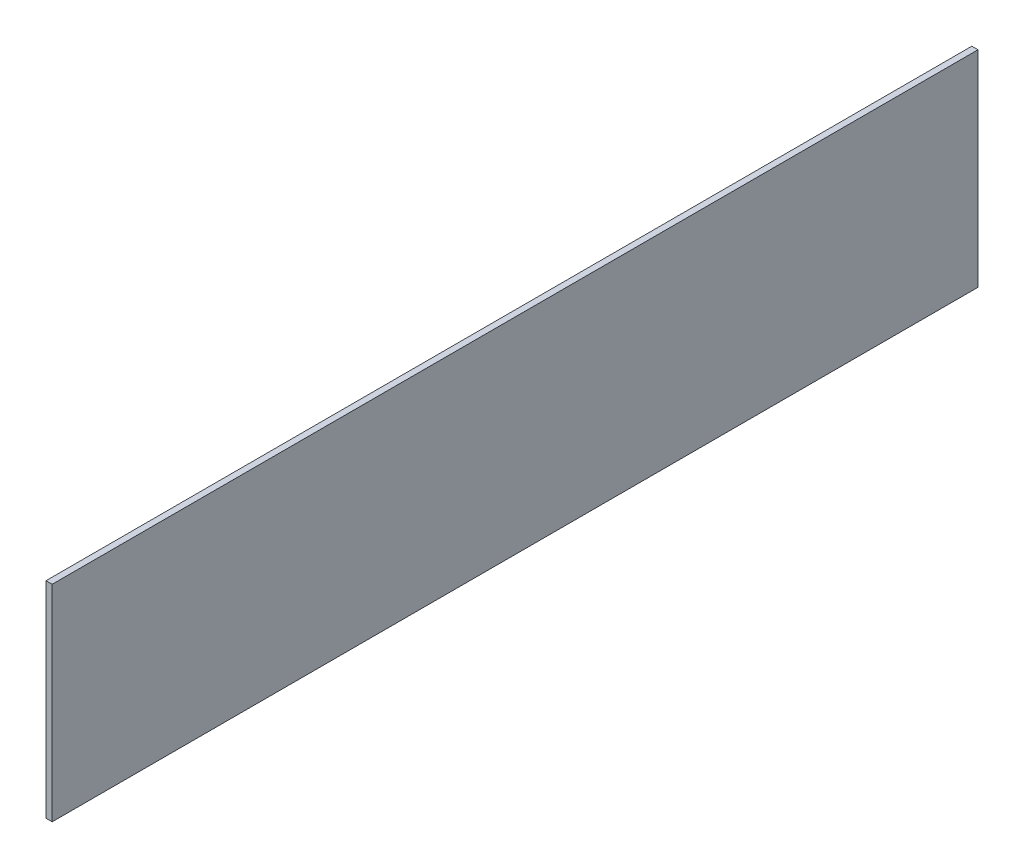
ISO-10303-21;
HEADER;
FILE_DESCRIPTION(('STEP AP214'),'2;1');
FILE_NAME('part.step','',(''),(''),'','','');
FILE_SCHEMA(('AUTOMOTIVE_DESIGN { 1 0 10303 214 1 1 1 1 }'));
ENDSEC;
DATA;
#1=APPLICATION_CONTEXT('core data for automotive mechanical design processes');
#2=APPLICATION_PROTOCOL_DEFINITION('international standard','automotive_design',2000,#1);
#3=PRODUCT_CONTEXT('',#1,'mechanical');
#4=PRODUCT('Part','Part','',(#3));
#5=PRODUCT_RELATED_PRODUCT_CATEGORY('part','',(#4));
#6=PRODUCT_DEFINITION_FORMATION('','',#4);
#7=PRODUCT_DEFINITION_CONTEXT('part definition',#1,'design');
#8=PRODUCT_DEFINITION('design','',#6,#7);
#9=PRODUCT_DEFINITION_SHAPE('','',#8);
#10=(LENGTH_UNIT() NAMED_UNIT(*) SI_UNIT(.MILLI.,.METRE.));
#11=(NAMED_UNIT(*) PLANE_ANGLE_UNIT() SI_UNIT($,.RADIAN.));
#12=(NAMED_UNIT(*) SI_UNIT($,.STERADIAN.) SOLID_ANGLE_UNIT());
#13=UNCERTAINTY_MEASURE_WITH_UNIT(LENGTH_MEASURE(1.E-05),#10,'distance_accuracy_value','');
#14=(GEOMETRIC_REPRESENTATION_CONTEXT(3) GLOBAL_UNCERTAINTY_ASSIGNED_CONTEXT((#13)) GLOBAL_UNIT_ASSIGNED_CONTEXT((#10,
#11,#12)) REPRESENTATION_CONTEXT('',''));
#15=CARTESIAN_POINT('',(0.,0.,0.));
#16=DIRECTION('',(0.,0.,1.));
#17=DIRECTION('',(1.,0.,0.));
#18=AXIS2_PLACEMENT_3D('',#15,#16,#17);
#19=CARTESIAN_POINT('',(3.,50.,-225.));
#20=DIRECTION('',(0.,0.,1.));
#21=DIRECTION('',(0.,-1.,0.));
#22=AXIS2_PLACEMENT_3D('',#19,#20,#21);
#23=PLANE('',#22);
#24=DIRECTION('',(0.,1.,0.));
#25=VECTOR('',#24,1.);
#26=CARTESIAN_POINT('',(0.,50.,-225.));
#27=LINE('',#26,#25);
#28=CARTESIAN_POINT('',(0.,-50.,-225.));
#29=VERTEX_POINT('',#28);
#30=CARTESIAN_POINT('',(0.,50.,-225.));
#31=VERTEX_POINT('',#30);
#32=EDGE_CURVE('E99',#29,#31,#27,.T.);
#33=ORIENTED_EDGE('',*,*,#32,.T.);
#34=DIRECTION('',(-1.,0.,0.));
#35=VECTOR('',#34,1.);
#36=CARTESIAN_POINT('',(3.,50.,-225.));
#37=LINE('',#36,#35);
#38=CARTESIAN_POINT('',(3.,50.,-225.));
#39=VERTEX_POINT('',#38);
#40=EDGE_CURVE('E11',#39,#31,#37,.T.);
#41=ORIENTED_EDGE('',*,*,#40,.F.);
#42=DIRECTION('',(0.,1.,0.));
#43=VECTOR('',#42,1.);
#44=CARTESIAN_POINT('',(3.,50.,-225.));
#45=LINE('',#44,#43);
#46=CARTESIAN_POINT('',(3.,-50.,-225.));
#47=VERTEX_POINT('',#46);
#48=EDGE_CURVE('E87',#47,#39,#45,.T.);
#49=ORIENTED_EDGE('',*,*,#48,.F.);
#50=DIRECTION('',(-1.,0.,0.));
#51=VECTOR('',#50,1.);
#52=CARTESIAN_POINT('',(3.,-50.,-225.));
#53=LINE('',#52,#51);
#54=EDGE_CURVE('E95',#47,#29,#53,.T.);
#55=ORIENTED_EDGE('',*,*,#54,.T.);
#56=EDGE_LOOP('',(#33,#41,#49,#55));
#57=FACE_BOUND('',#56,.T.);
#58=ADVANCED_FACE('F36',(#57),#23,.F.);
#59=CARTESIAN_POINT('',(3.,50.,225.));
#60=DIRECTION('',(0.,-1.,0.));
#61=DIRECTION('',(0.,0.,-1.));
#62=AXIS2_PLACEMENT_3D('',#59,#60,#61);
#63=PLANE('',#62);
#64=DIRECTION('',(0.,0.,1.));
#65=VECTOR('',#64,1.);
#66=CARTESIAN_POINT('',(0.,50.,225.));
#67=LINE('',#66,#65);
#68=CARTESIAN_POINT('',(0.,50.,225.));
#69=VERTEX_POINT('',#68);
#70=EDGE_CURVE('E91',#31,#69,#67,.T.);
#71=ORIENTED_EDGE('',*,*,#70,.T.);
#72=DIRECTION('',(-1.,0.,0.));
#73=VECTOR('',#72,1.);
#74=CARTESIAN_POINT('',(3.,50.,225.));
#75=LINE('',#74,#73);
#76=CARTESIAN_POINT('',(3.,50.,225.));
#77=VERTEX_POINT('',#76);
#78=EDGE_CURVE('E44',#77,#69,#75,.T.);
#79=ORIENTED_EDGE('',*,*,#78,.F.);
#80=DIRECTION('',(0.,0.,1.));
#81=VECTOR('',#80,1.);
#82=CARTESIAN_POINT('',(3.,50.,225.));
#83=LINE('',#82,#81);
#84=EDGE_CURVE('E82',#39,#77,#83,.T.);
#85=ORIENTED_EDGE('',*,*,#84,.F.);
#86=ORIENTED_EDGE('',*,*,#40,.T.);
#87=EDGE_LOOP('',(#71,#79,#85,#86));
#88=FACE_BOUND('',#87,.T.);
#89=ADVANCED_FACE('F90',(#88),#63,.F.);
#90=CARTESIAN_POINT('',(3.,50.,225.));
#91=DIRECTION('',(0.,0.,-1.));
#92=DIRECTION('',(-1.,0.,0.));
#93=AXIS2_PLACEMENT_3D('',#90,#91,#92);
#94=PLANE('',#93);
#95=DIRECTION('',(0.,-1.,0.));
#96=VECTOR('',#95,1.);
#97=CARTESIAN_POINT('',(0.,50.,225.));
#98=LINE('',#97,#96);
#99=CARTESIAN_POINT('',(0.,-50.,225.));
#100=VERTEX_POINT('',#99);
#101=EDGE_CURVE('E69',#69,#100,#98,.T.);
#102=ORIENTED_EDGE('',*,*,#101,.T.);
#103=DIRECTION('',(-1.,0.,0.));
#104=VECTOR('',#103,1.);
#105=CARTESIAN_POINT('',(3.,-50.,225.));
#106=LINE('',#105,#104);
#107=CARTESIAN_POINT('',(3.,-50.,225.));
#108=VERTEX_POINT('',#107);
#109=EDGE_CURVE('E92',#108,#100,#106,.T.);
#110=ORIENTED_EDGE('',*,*,#109,.F.);
#111=DIRECTION('',(0.,-1.,0.));
#112=VECTOR('',#111,1.);
#113=CARTESIAN_POINT('',(3.,50.,225.));
#114=LINE('',#113,#112);
#115=EDGE_CURVE('E85',#77,#108,#114,.T.);
#116=ORIENTED_EDGE('',*,*,#115,.F.);
#117=ORIENTED_EDGE('',*,*,#78,.T.);
#118=EDGE_LOOP('',(#102,#110,#116,#117));
#119=FACE_BOUND('',#118,.T.);
#120=ADVANCED_FACE('F93',(#119),#94,.F.);
#121=CARTESIAN_POINT('',(3.,-50.,225.));
#122=DIRECTION('',(0.,1.,0.));
#123=DIRECTION('',(0.,0.,1.));
#124=AXIS2_PLACEMENT_3D('',#121,#122,#123);
#125=PLANE('',#124);
#126=DIRECTION('',(0.,0.,-1.));
#127=VECTOR('',#126,1.);
#128=CARTESIAN_POINT('',(0.,-50.,225.));
#129=LINE('',#128,#127);
#130=EDGE_CURVE('E75',#100,#29,#129,.T.);
#131=ORIENTED_EDGE('',*,*,#130,.T.);
#132=ORIENTED_EDGE('',*,*,#54,.F.);
#133=DIRECTION('',(0.,0.,-1.));
#134=VECTOR('',#133,1.);
#135=CARTESIAN_POINT('',(3.,-50.,225.));
#136=LINE('',#135,#134);
#137=EDGE_CURVE('E52',#108,#47,#136,.T.);
#138=ORIENTED_EDGE('',*,*,#137,.F.);
#139=ORIENTED_EDGE('',*,*,#109,.T.);
#140=EDGE_LOOP('',(#131,#132,#138,#139));
#141=FACE_BOUND('',#140,.T.);
#142=ADVANCED_FACE('F106',(#141),#125,.F.);
#143=CARTESIAN_POINT('',(3.,0.,0.));
#144=DIRECTION('',(1.,0.,0.));
#145=DIRECTION('',(0.,0.,-1.));
#146=AXIS2_PLACEMENT_3D('',#143,#144,#145);
#147=PLANE('',#146);
#148=ORIENTED_EDGE('',*,*,#48,.T.);
#149=ORIENTED_EDGE('',*,*,#84,.T.);
#150=ORIENTED_EDGE('',*,*,#115,.T.);
#151=ORIENTED_EDGE('',*,*,#137,.T.);
#152=EDGE_LOOP('',(#148,#149,#150,#151));
#153=FACE_BOUND('',#152,.T.);
#154=ADVANCED_FACE('F83',(#153),#147,.T.);
#155=CARTESIAN_POINT('',(0.,0.,0.));
#156=DIRECTION('',(1.,0.,0.));
#157=DIRECTION('',(0.,0.,-1.));
#158=AXIS2_PLACEMENT_3D('',#155,#156,#157);
#159=PLANE('',#158);
#160=ORIENTED_EDGE('',*,*,#32,.F.);
#161=ORIENTED_EDGE('',*,*,#130,.F.);
#162=ORIENTED_EDGE('',*,*,#101,.F.);
#163=ORIENTED_EDGE('',*,*,#70,.F.);
#164=EDGE_LOOP('',(#160,#161,#162,#163));
#165=FACE_BOUND('',#164,.T.);
#166=ADVANCED_FACE('F109',(#165),#159,.F.);
#167=CLOSED_SHELL('',(#58,#89,#120,#142,#154,#166));
#168=MANIFOLD_SOLID_BREP('B2',#167);
#169=ADVANCED_BREP_SHAPE_REPRESENTATION('',(#18,#168),#14);
#170=SHAPE_DEFINITION_REPRESENTATION(#9,#169);
ENDSEC;
END-ISO-10303-21;
